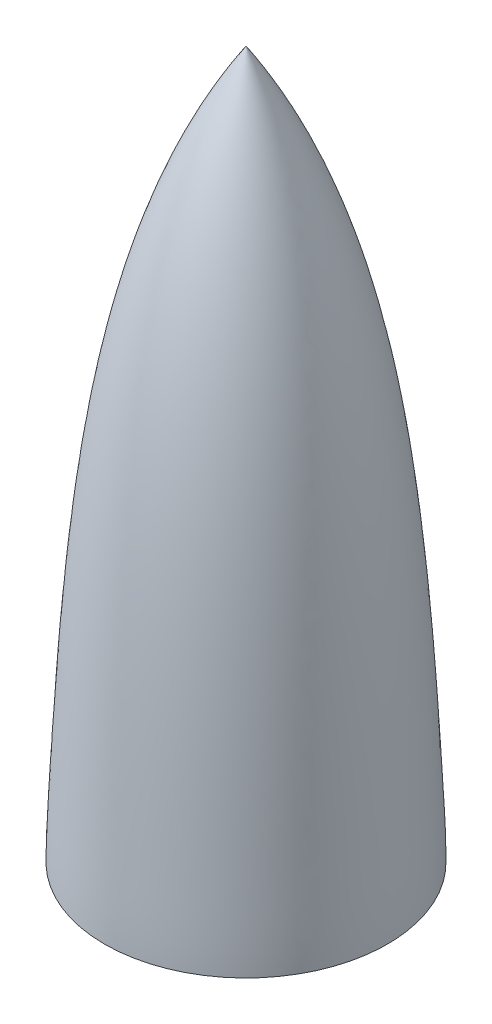
ISO-10303-21;
HEADER;
FILE_DESCRIPTION(('STEP AP214'),'2;1');
FILE_NAME('part.step','',(''),(''),'','','');
FILE_SCHEMA(('AUTOMOTIVE_DESIGN { 1 0 10303 214 1 1 1 1 }'));
ENDSEC;
DATA;
#1=APPLICATION_CONTEXT('core data for automotive mechanical design processes');
#2=APPLICATION_PROTOCOL_DEFINITION('international standard','automotive_design',2000,#1);
#3=PRODUCT_CONTEXT('',#1,'mechanical');
#4=PRODUCT('Part','Part','',(#3));
#5=PRODUCT_RELATED_PRODUCT_CATEGORY('part','',(#4));
#6=PRODUCT_DEFINITION_FORMATION('','',#4);
#7=PRODUCT_DEFINITION_CONTEXT('part definition',#1,'design');
#8=PRODUCT_DEFINITION('design','',#6,#7);
#9=PRODUCT_DEFINITION_SHAPE('','',#8);
#10=(LENGTH_UNIT() NAMED_UNIT(*) SI_UNIT(.MILLI.,.METRE.));
#11=(NAMED_UNIT(*) PLANE_ANGLE_UNIT() SI_UNIT($,.RADIAN.));
#12=(NAMED_UNIT(*) SI_UNIT($,.STERADIAN.) SOLID_ANGLE_UNIT());
#13=UNCERTAINTY_MEASURE_WITH_UNIT(LENGTH_MEASURE(1.E-05),#10,'distance_accuracy_value','');
#14=(GEOMETRIC_REPRESENTATION_CONTEXT(3) GLOBAL_UNCERTAINTY_ASSIGNED_CONTEXT((#13)) GLOBAL_UNIT_ASSIGNED_CONTEXT((#10,
#11,#12)) REPRESENTATION_CONTEXT('',''));
#15=CARTESIAN_POINT('',(0.,0.,0.));
#16=DIRECTION('',(0.,0.,1.));
#17=DIRECTION('',(1.,0.,0.));
#18=AXIS2_PLACEMENT_3D('',#15,#16,#17);
#19=CARTESIAN_POINT('',(0.,387.790303549033,0.));
#20=CARTESIAN_POINT('',(0.,338.940718932169,-29.8233526919742));
#21=CARTESIAN_POINT('',(0.,238.007452452575,-60.2420201928084));
#22=CARTESIAN_POINT('',(0.,117.062368112484,-70.9112919038981));
#23=CARTESIAN_POINT('',(0.,41.4641193337638,-74.797618010204));
#24=CARTESIAN_POINT('',(0.,11.6809790094562,-76.2000000000001));
#25=CARTESIAN_POINT('',(0.,0.,-76.2000000000001));
#26=B_SPLINE_CURVE_WITH_KNOTS('',3,(#19,#20,#21,#22,#23,#24,#25),.UNSPECIFIED.,.F.,.F.,(4,1,1,1,
4),(0.,0.42874596046835,0.778809241256005,0.910512261707689,1.),.UNSPECIFIED.);
#27=CARTESIAN_POINT('',(0.,0.,0.));
#28=DIRECTION('',(0.,-1.,0.));
#29=AXIS1_PLACEMENT('',#27,#28);
#30=SURFACE_OF_REVOLUTION('',#26,#29);
#31=CARTESIAN_POINT('',(0.,0.,0.));
#32=DIRECTION('',(0.,-1.,0.));
#33=DIRECTION('',(0.,0.,-1.));
#34=AXIS2_PLACEMENT_3D('',#31,#32,#33);
#35=CIRCLE('',#34,76.2000000000001);
#36=CARTESIAN_POINT('',(0.,0.,-76.2000000000001));
#37=VERTEX_POINT('',#36);
#38=EDGE_CURVE('E11',#37,#37,#35,.T.);
#39=ORIENTED_EDGE('',*,*,#38,.T.);
#40=EDGE_LOOP('',(#39));
#41=FACE_BOUND('',#40,.T.);
#42=CARTESIAN_POINT('',(0.,387.790303549033,-1.16154781565477E-11));
#43=VERTEX_POINT('',#42);
#44=VERTEX_LOOP('',#43);
#45=FACE_BOUND('',#44,.T.);
#46=ADVANCED_FACE('F33',(#41,#45),#30,.F.);
#47=CARTESIAN_POINT('',(0.,0.,0.));
#48=DIRECTION('',(0.,1.,0.));
#49=DIRECTION('',(0.,0.,1.));
#50=AXIS2_PLACEMENT_3D('',#47,#48,#49);
#51=PLANE('',#50);
#52=ORIENTED_EDGE('',*,*,#38,.F.);
#53=EDGE_LOOP('',(#52));
#54=FACE_BOUND('',#53,.T.);
#55=CARTESIAN_POINT('',(0.,0.,0.));
#56=DIRECTION('',(0.,-1.,0.));
#57=DIRECTION('',(0.,0.,-1.));
#58=AXIS2_PLACEMENT_3D('',#55,#56,#57);
#59=CIRCLE('',#58,78.359);
#60=CARTESIAN_POINT('',(0.,0.,-78.359));
#61=VERTEX_POINT('',#60);
#62=EDGE_CURVE('E41',#61,#61,#59,.T.);
#63=ORIENTED_EDGE('',*,*,#62,.T.);
#64=EDGE_LOOP('',(#63));
#65=FACE_BOUND('',#64,.T.);
#66=ADVANCED_FACE('F48',(#54,#65),#51,.F.);
#67=CARTESIAN_POINT('',(0.,391.795,0.));
#68=CARTESIAN_POINT('',(0.,325.221489098334,-43.3405354103036));
#69=CARTESIAN_POINT('',(0.,202.667379203713,-68.7289893786833));
#70=CARTESIAN_POINT('',(0.,68.4475501742133,-75.6422852216483));
#71=CARTESIAN_POINT('',(0.,11.9131989427564,-78.359));
#72=CARTESIAN_POINT('',(0.,0.,-78.359));
#73=B_SPLINE_CURVE_WITH_KNOTS('',3,(#67,#68,#69,#70,#71,#72),.UNSPECIFIED.,.F.,.F.,(4,1,1,4),
(0.,0.579778718922735,0.911588502961517,1.),.UNSPECIFIED.);
#74=CARTESIAN_POINT('',(0.,0.,0.));
#75=DIRECTION('',(0.,-1.,0.));
#76=AXIS1_PLACEMENT('',#74,#75);
#77=SURFACE_OF_REVOLUTION('',#73,#76);
#78=ORIENTED_EDGE('',*,*,#62,.F.);
#79=EDGE_LOOP('',(#78));
#80=FACE_BOUND('',#79,.T.);
#81=CARTESIAN_POINT('',(0.,391.795,-1.17354307797157E-11));
#82=VERTEX_POINT('',#81);
#83=VERTEX_LOOP('',#82);
#84=FACE_BOUND('',#83,.T.);
#85=ADVANCED_FACE('F53',(#80,#84),#77,.T.);
#86=CLOSED_SHELL('',(#46,#66,#85));
#87=MANIFOLD_SOLID_BREP('B2',#86);
#88=ADVANCED_BREP_SHAPE_REPRESENTATION('',(#18,#87),#14);
#89=SHAPE_DEFINITION_REPRESENTATION(#9,#88);
ENDSEC;
END-ISO-10303-21;
